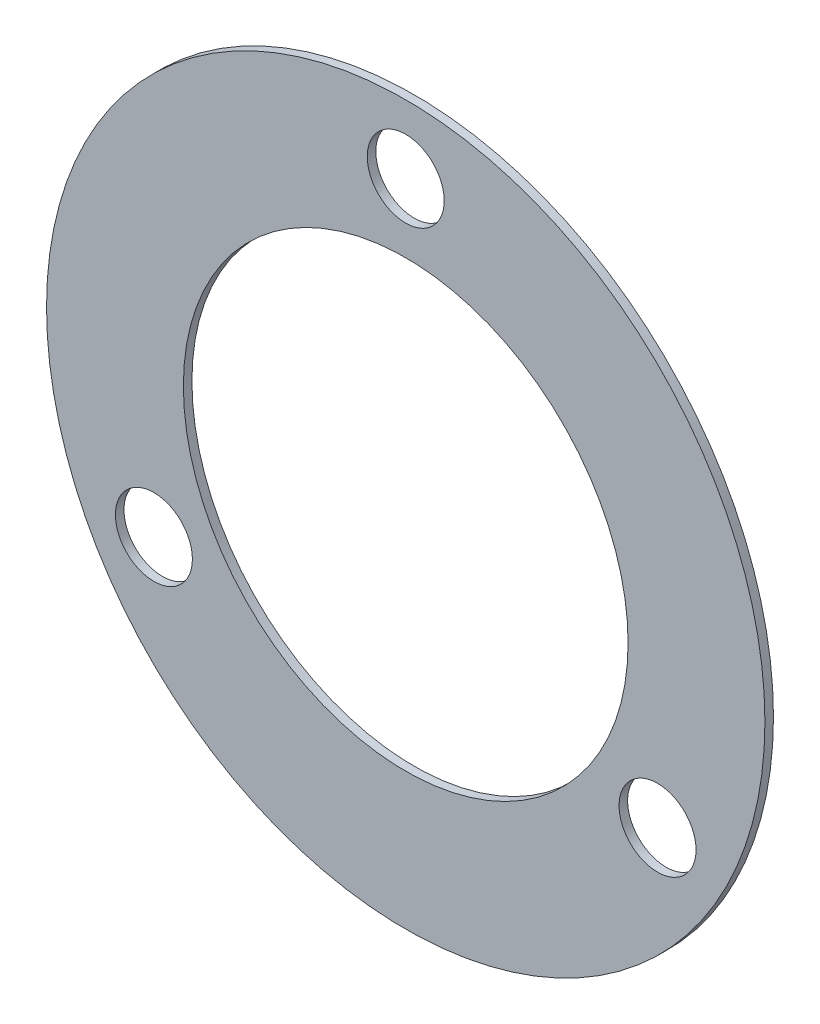
ISO-10303-21;
HEADER;
FILE_DESCRIPTION(('STEP AP214'),'2;1');
FILE_NAME('part.step','',(''),(''),'','','');
FILE_SCHEMA(('AUTOMOTIVE_DESIGN { 1 0 10303 214 1 1 1 1 }'));
ENDSEC;
DATA;
#1=APPLICATION_CONTEXT('core data for automotive mechanical design processes');
#2=APPLICATION_PROTOCOL_DEFINITION('international standard','automotive_design',2000,#1);
#3=PRODUCT_CONTEXT('',#1,'mechanical');
#4=PRODUCT('Part','Part','',(#3));
#5=PRODUCT_RELATED_PRODUCT_CATEGORY('part','',(#4));
#6=PRODUCT_DEFINITION_FORMATION('','',#4);
#7=PRODUCT_DEFINITION_CONTEXT('part definition',#1,'design');
#8=PRODUCT_DEFINITION('design','',#6,#7);
#9=PRODUCT_DEFINITION_SHAPE('','',#8);
#10=(LENGTH_UNIT() NAMED_UNIT(*) SI_UNIT(.MILLI.,.METRE.));
#11=(NAMED_UNIT(*) PLANE_ANGLE_UNIT() SI_UNIT($,.RADIAN.));
#12=(NAMED_UNIT(*) SI_UNIT($,.STERADIAN.) SOLID_ANGLE_UNIT());
#13=UNCERTAINTY_MEASURE_WITH_UNIT(LENGTH_MEASURE(1.E-05),#10,'distance_accuracy_value','');
#14=(GEOMETRIC_REPRESENTATION_CONTEXT(3) GLOBAL_UNCERTAINTY_ASSIGNED_CONTEXT((#13)) GLOBAL_UNIT_ASSIGNED_CONTEXT((#10,
#11,#12)) REPRESENTATION_CONTEXT('',''));
#15=CARTESIAN_POINT('',(0.,0.,0.));
#16=DIRECTION('',(0.,0.,1.));
#17=DIRECTION('',(1.,0.,0.));
#18=AXIS2_PLACEMENT_3D('',#15,#16,#17);
#19=CARTESIAN_POINT('',(0.,0.,1.));
#20=DIRECTION('',(0.,0.,1.));
#21=DIRECTION('',(1.,0.,0.));
#22=AXIS2_PLACEMENT_3D('',#19,#20,#21);
#23=PLANE('',#22);
#24=CARTESIAN_POINT('',(29.4448637286731,-16.9999999999988,1.));
#25=DIRECTION('',(0.,0.,1.));
#26=DIRECTION('',(1.,0.,0.));
#27=AXIS2_PLACEMENT_3D('',#24,#25,#26);
#28=CIRCLE('',#27,4.50000000000186);
#29=CARTESIAN_POINT('',(33.9448637286749,-16.9999999999988,1.));
#30=VERTEX_POINT('',#29);
#31=EDGE_CURVE('E53',#30,#30,#28,.T.);
#32=ORIENTED_EDGE('',*,*,#31,.F.);
#33=EDGE_LOOP('',(#32));
#34=FACE_BOUND('',#33,.T.);
#35=CARTESIAN_POINT('',(0.,0.,1.));
#36=DIRECTION('',(0.,0.,1.));
#37=DIRECTION('',(1.,0.,0.));
#38=AXIS2_PLACEMENT_3D('',#35,#36,#37);
#39=CIRCLE('',#38,26.);
#40=CARTESIAN_POINT('',(26.,0.,1.));
#41=VERTEX_POINT('',#40);
#42=EDGE_CURVE('E42',#41,#41,#39,.T.);
#43=ORIENTED_EDGE('',*,*,#42,.F.);
#44=EDGE_LOOP('',(#43));
#45=FACE_BOUND('',#44,.T.);
#46=CARTESIAN_POINT('',(0.,0.,1.));
#47=DIRECTION('',(0.,0.,1.));
#48=DIRECTION('',(1.,0.,0.));
#49=AXIS2_PLACEMENT_3D('',#46,#47,#48);
#50=CIRCLE('',#49,42.);
#51=CARTESIAN_POINT('',(42.,0.,1.));
#52=VERTEX_POINT('',#51);
#53=EDGE_CURVE('E10',#52,#52,#50,.T.);
#54=ORIENTED_EDGE('',*,*,#53,.T.);
#55=EDGE_LOOP('',(#54));
#56=FACE_BOUND('',#55,.T.);
#57=CARTESIAN_POINT('',(0.,34.,1.));
#58=DIRECTION('',(0.,0.,1.));
#59=DIRECTION('',(1.,0.,0.));
#60=AXIS2_PLACEMENT_3D('',#57,#58,#59);
#61=CIRCLE('',#60,4.5);
#62=CARTESIAN_POINT('',(4.5,34.,1.));
#63=VERTEX_POINT('',#62);
#64=EDGE_CURVE('E47',#63,#63,#61,.T.);
#65=ORIENTED_EDGE('',*,*,#64,.F.);
#66=EDGE_LOOP('',(#65));
#67=FACE_BOUND('',#66,.T.);
#68=CARTESIAN_POINT('',(-29.4448637286688,-17.0000000000013,1.));
#69=DIRECTION('',(0.,0.,1.));
#70=DIRECTION('',(1.,0.,0.));
#71=AXIS2_PLACEMENT_3D('',#68,#69,#70);
#72=CIRCLE('',#71,4.50000000000275);
#73=CARTESIAN_POINT('',(-24.944863728666,-17.0000000000013,1.));
#74=VERTEX_POINT('',#73);
#75=EDGE_CURVE('E59',#74,#74,#72,.T.);
#76=ORIENTED_EDGE('',*,*,#75,.F.);
#77=EDGE_LOOP('',(#76));
#78=FACE_BOUND('',#77,.T.);
#79=ADVANCED_FACE('F31',(#34,#45,#56,#67,#78),#23,.T.);
#80=CARTESIAN_POINT('',(0.,0.,0.));
#81=DIRECTION('',(0.,0.,1.));
#82=DIRECTION('',(1.,0.,0.));
#83=AXIS2_PLACEMENT_3D('',#80,#81,#82);
#84=PLANE('',#83);
#85=CARTESIAN_POINT('',(0.,0.,0.));
#86=DIRECTION('',(0.,0.,1.));
#87=DIRECTION('',(1.,0.,0.));
#88=AXIS2_PLACEMENT_3D('',#85,#86,#87);
#89=CIRCLE('',#88,42.);
#90=CARTESIAN_POINT('',(42.,0.,0.));
#91=VERTEX_POINT('',#90);
#92=EDGE_CURVE('E35',#91,#91,#89,.T.);
#93=ORIENTED_EDGE('',*,*,#92,.F.);
#94=EDGE_LOOP('',(#93));
#95=FACE_BOUND('',#94,.T.);
#96=CARTESIAN_POINT('',(0.,0.,0.));
#97=DIRECTION('',(0.,0.,1.));
#98=DIRECTION('',(1.,0.,0.));
#99=AXIS2_PLACEMENT_3D('',#96,#97,#98);
#100=CIRCLE('',#99,26.);
#101=CARTESIAN_POINT('',(26.,0.,0.));
#102=VERTEX_POINT('',#101);
#103=EDGE_CURVE('E44',#102,#102,#100,.T.);
#104=ORIENTED_EDGE('',*,*,#103,.T.);
#105=EDGE_LOOP('',(#104));
#106=FACE_BOUND('',#105,.T.);
#107=CARTESIAN_POINT('',(0.,34.,0.));
#108=DIRECTION('',(0.,0.,1.));
#109=DIRECTION('',(1.,0.,0.));
#110=AXIS2_PLACEMENT_3D('',#107,#108,#109);
#111=CIRCLE('',#110,4.5);
#112=CARTESIAN_POINT('',(4.5,34.,0.));
#113=VERTEX_POINT('',#112);
#114=EDGE_CURVE('E50',#113,#113,#111,.T.);
#115=ORIENTED_EDGE('',*,*,#114,.T.);
#116=EDGE_LOOP('',(#115));
#117=FACE_BOUND('',#116,.T.);
#118=CARTESIAN_POINT('',(29.4448637286731,-16.9999999999988,0.));
#119=DIRECTION('',(0.,0.,1.));
#120=DIRECTION('',(1.,0.,0.));
#121=AXIS2_PLACEMENT_3D('',#118,#119,#120);
#122=CIRCLE('',#121,4.50000000000186);
#123=CARTESIAN_POINT('',(33.9448637286749,-16.9999999999988,0.));
#124=VERTEX_POINT('',#123);
#125=EDGE_CURVE('E56',#124,#124,#122,.T.);
#126=ORIENTED_EDGE('',*,*,#125,.T.);
#127=EDGE_LOOP('',(#126));
#128=FACE_BOUND('',#127,.T.);
#129=CARTESIAN_POINT('',(-29.4448637286688,-17.0000000000013,0.));
#130=DIRECTION('',(0.,0.,1.));
#131=DIRECTION('',(1.,0.,0.));
#132=AXIS2_PLACEMENT_3D('',#129,#130,#131);
#133=CIRCLE('',#132,4.50000000000275);
#134=CARTESIAN_POINT('',(-24.944863728666,-17.0000000000013,0.));
#135=VERTEX_POINT('',#134);
#136=EDGE_CURVE('E62',#135,#135,#133,.T.);
#137=ORIENTED_EDGE('',*,*,#136,.T.);
#138=EDGE_LOOP('',(#137));
#139=FACE_BOUND('',#138,.T.);
#140=ADVANCED_FACE('F72',(#95,#106,#117,#128,#139),#84,.F.);
#141=CARTESIAN_POINT('',(0.,0.,1.));
#142=DIRECTION('',(0.,0.,-1.));
#143=DIRECTION('',(-1.,0.,0.));
#144=AXIS2_PLACEMENT_3D('',#141,#142,#143);
#145=CYLINDRICAL_SURFACE('',#144,42.);
#146=ORIENTED_EDGE('',*,*,#53,.F.);
#147=EDGE_LOOP('',(#146));
#148=FACE_BOUND('',#147,.T.);
#149=ORIENTED_EDGE('',*,*,#92,.T.);
#150=EDGE_LOOP('',(#149));
#151=FACE_BOUND('',#150,.T.);
#152=ADVANCED_FACE('F33',(#148,#151),#145,.T.);
#153=CARTESIAN_POINT('',(0.,0.,1.));
#154=DIRECTION('',(0.,0.,-1.));
#155=DIRECTION('',(-1.,0.,0.));
#156=AXIS2_PLACEMENT_3D('',#153,#154,#155);
#157=CYLINDRICAL_SURFACE('',#156,26.);
#158=ORIENTED_EDGE('',*,*,#42,.T.);
#159=EDGE_LOOP('',(#158));
#160=FACE_BOUND('',#159,.T.);
#161=ORIENTED_EDGE('',*,*,#103,.F.);
#162=EDGE_LOOP('',(#161));
#163=FACE_BOUND('',#162,.T.);
#164=ADVANCED_FACE('F82',(#160,#163),#157,.F.);
#165=CARTESIAN_POINT('',(0.,34.,1.));
#166=DIRECTION('',(0.,0.,-1.));
#167=DIRECTION('',(-1.,0.,0.));
#168=AXIS2_PLACEMENT_3D('',#165,#166,#167);
#169=CYLINDRICAL_SURFACE('',#168,4.5);
#170=ORIENTED_EDGE('',*,*,#64,.T.);
#171=EDGE_LOOP('',(#170));
#172=FACE_BOUND('',#171,.T.);
#173=ORIENTED_EDGE('',*,*,#114,.F.);
#174=EDGE_LOOP('',(#173));
#175=FACE_BOUND('',#174,.T.);
#176=ADVANCED_FACE('F85',(#172,#175),#169,.F.);
#177=CARTESIAN_POINT('',(29.4448637286731,-16.9999999999988,1.));
#178=DIRECTION('',(0.,0.,-1.));
#179=DIRECTION('',(-1.,0.,0.));
#180=AXIS2_PLACEMENT_3D('',#177,#178,#179);
#181=CYLINDRICAL_SURFACE('',#180,4.50000000000186);
#182=ORIENTED_EDGE('',*,*,#31,.T.);
#183=EDGE_LOOP('',(#182));
#184=FACE_BOUND('',#183,.T.);
#185=ORIENTED_EDGE('',*,*,#125,.F.);
#186=EDGE_LOOP('',(#185));
#187=FACE_BOUND('',#186,.T.);
#188=ADVANCED_FACE('F89',(#184,#187),#181,.F.);
#189=CARTESIAN_POINT('',(-29.4448637286688,-17.0000000000013,1.));
#190=DIRECTION('',(0.,0.,-1.));
#191=DIRECTION('',(-1.,0.,0.));
#192=AXIS2_PLACEMENT_3D('',#189,#190,#191);
#193=CYLINDRICAL_SURFACE('',#192,4.50000000000275);
#194=ORIENTED_EDGE('',*,*,#75,.T.);
#195=EDGE_LOOP('',(#194));
#196=FACE_BOUND('',#195,.T.);
#197=ORIENTED_EDGE('',*,*,#136,.F.);
#198=EDGE_LOOP('',(#197));
#199=FACE_BOUND('',#198,.T.);
#200=ADVANCED_FACE('F68',(#196,#199),#193,.F.);
#201=CLOSED_SHELL('',(#79,#140,#152,#164,#176,#188,#200));
#202=MANIFOLD_SOLID_BREP('B2',#201);
#203=ADVANCED_BREP_SHAPE_REPRESENTATION('',(#18,#202),#14);
#204=SHAPE_DEFINITION_REPRESENTATION(#9,#203);
ENDSEC;
END-ISO-10303-21;
